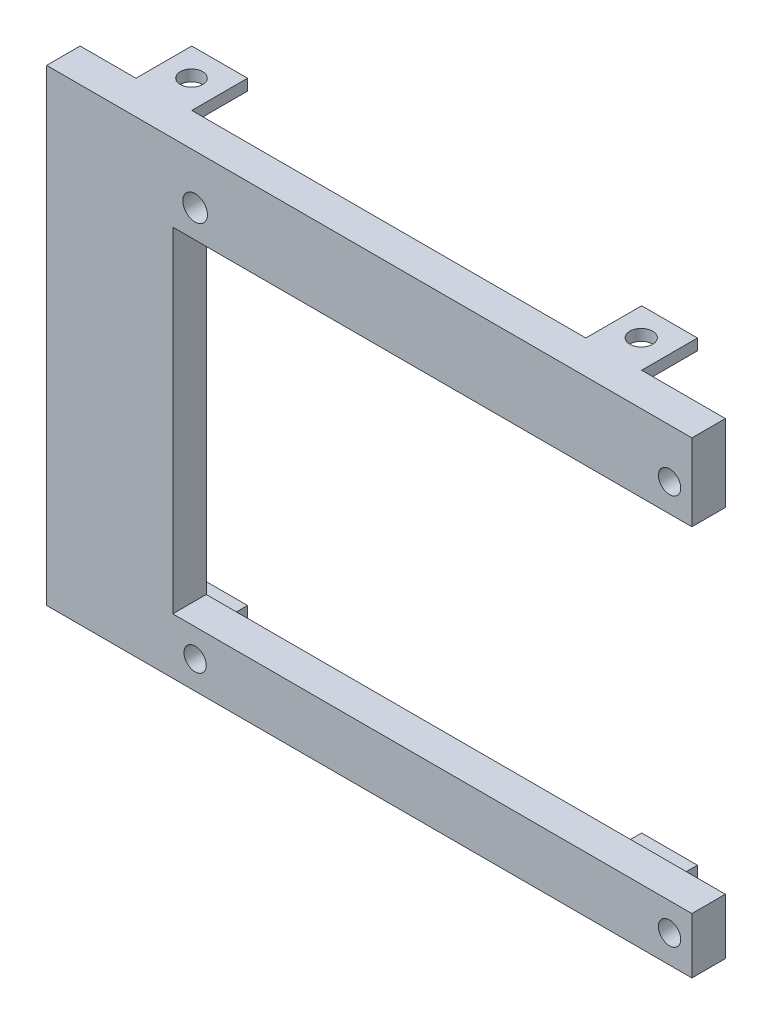
ISO-10303-21;
HEADER;
FILE_DESCRIPTION(('STEP AP214'),'2;1');
FILE_NAME('part.step','',(''),(''),'','','');
FILE_SCHEMA(('AUTOMOTIVE_DESIGN { 1 0 10303 214 1 1 1 1 }'));
ENDSEC;
DATA;
#1=APPLICATION_CONTEXT('core data for automotive mechanical design processes');
#2=APPLICATION_PROTOCOL_DEFINITION('international standard','automotive_design',2000,#1);
#3=PRODUCT_CONTEXT('',#1,'mechanical');
#4=PRODUCT('Part','Part','',(#3));
#5=PRODUCT_RELATED_PRODUCT_CATEGORY('part','',(#4));
#6=PRODUCT_DEFINITION_FORMATION('','',#4);
#7=PRODUCT_DEFINITION_CONTEXT('part definition',#1,'design');
#8=PRODUCT_DEFINITION('design','',#6,#7);
#9=PRODUCT_DEFINITION_SHAPE('','',#8);
#10=(LENGTH_UNIT() NAMED_UNIT(*) SI_UNIT(.MILLI.,.METRE.));
#11=(NAMED_UNIT(*) PLANE_ANGLE_UNIT() SI_UNIT($,.RADIAN.));
#12=(NAMED_UNIT(*) SI_UNIT($,.STERADIAN.) SOLID_ANGLE_UNIT());
#13=UNCERTAINTY_MEASURE_WITH_UNIT(LENGTH_MEASURE(1.E-05),#10,'distance_accuracy_value','');
#14=(GEOMETRIC_REPRESENTATION_CONTEXT(3) GLOBAL_UNCERTAINTY_ASSIGNED_CONTEXT((#13)) GLOBAL_UNIT_ASSIGNED_CONTEXT((#10,
#11,#12)) REPRESENTATION_CONTEXT('',''));
#15=CARTESIAN_POINT('',(0.,0.,0.));
#16=DIRECTION('',(0.,0.,1.));
#17=DIRECTION('',(1.,0.,0.));
#18=AXIS2_PLACEMENT_3D('',#15,#16,#17);
#19=CARTESIAN_POINT('',(-451.806796116505,304.386737633236,-5.99999999999989));
#20=DIRECTION('',(0.,0.,-1.));
#21=DIRECTION('',(-1.,0.,0.));
#22=AXIS2_PLACEMENT_3D('',#19,#20,#21);
#23=PLANE('',#22);
#24=CARTESIAN_POINT('',(-494.306796116505,269.386737633236,-5.9999999999999));
#25=DIRECTION('',(0.,0.,-1.));
#26=DIRECTION('',(0.,1.,0.));
#27=AXIS2_PLACEMENT_3D('',#24,#25,#26);
#28=CIRCLE('',#27,2.);
#29=CARTESIAN_POINT('',(-494.306796116505,271.386737633236,-5.9999999999999));
#30=VERTEX_POINT('',#29);
#31=EDGE_CURVE('E408',#30,#30,#28,.T.);
#32=ORIENTED_EDGE('',*,*,#31,.F.);
#33=EDGE_LOOP('',(#32));
#34=FACE_BOUND('',#33,.T.);
#35=CARTESIAN_POINT('',(-409.306796116505,269.386737633236,-5.9999999999999));
#36=DIRECTION('',(0.,0.,-1.));
#37=DIRECTION('',(0.,1.,0.));
#38=AXIS2_PLACEMENT_3D('',#35,#36,#37);
#39=CIRCLE('',#38,2.00480196291707);
#40=CARTESIAN_POINT('',(-409.306796116505,271.391539596154,-5.9999999999999));
#41=VERTEX_POINT('',#40);
#42=EDGE_CURVE('E492',#41,#41,#39,.T.);
#43=ORIENTED_EDGE('',*,*,#42,.F.);
#44=EDGE_LOOP('',(#43));
#45=FACE_BOUND('',#44,.T.);
#46=CARTESIAN_POINT('',(-409.306796116505,339.386737633236,-5.99999999999989));
#47=DIRECTION('',(0.,0.,-1.));
#48=DIRECTION('',(0.,1.,0.));
#49=AXIS2_PLACEMENT_3D('',#46,#47,#48);
#50=CIRCLE('',#49,2.);
#51=CARTESIAN_POINT('',(-409.306796116505,341.386737633236,-5.99999999999989));
#52=VERTEX_POINT('',#51);
#53=EDGE_CURVE('E496',#52,#52,#50,.T.);
#54=ORIENTED_EDGE('',*,*,#53,.F.);
#55=EDGE_LOOP('',(#54));
#56=FACE_BOUND('',#55,.T.);
#57=CARTESIAN_POINT('',(-494.306796116505,339.386737633236,-5.99999999999988));
#58=DIRECTION('',(0.,0.,-1.));
#59=DIRECTION('',(0.,1.,0.));
#60=AXIS2_PLACEMENT_3D('',#57,#58,#59);
#61=CIRCLE('',#60,2.20694831770408);
#62=CARTESIAN_POINT('',(-494.306796116505,341.59368595094,-5.99999999999988));
#63=VERTEX_POINT('',#62);
#64=EDGE_CURVE('E499',#63,#63,#61,.T.);
#65=ORIENTED_EDGE('',*,*,#64,.F.);
#66=EDGE_LOOP('',(#65));
#67=FACE_BOUND('',#66,.T.);
#68=DIRECTION('',(1.,0.,0.));
#69=VECTOR('',#68,1.);
#70=CARTESIAN_POINT('',(-520.906796116505,264.386737633237,-5.99999999999989));
#71=LINE('',#70,#69);
#72=CARTESIAN_POINT('',(-420.306796116505,264.386737633237,-5.9999999999999));
#73=VERTEX_POINT('',#72);
#74=CARTESIAN_POINT('',(-405.306796116505,264.386737633237,-5.99999999999989));
#75=VERTEX_POINT('',#74);
#76=EDGE_CURVE('E375',#73,#75,#71,.T.);
#77=ORIENTED_EDGE('',*,*,#76,.F.);
#78=DIRECTION('',(0.,-1.,0.));
#79=VECTOR('',#78,1.);
#80=CARTESIAN_POINT('',(-420.306796116505,266.386737633237,-5.9999999999999));
#81=LINE('',#80,#79);
#82=CARTESIAN_POINT('',(-420.306796116505,266.386737633237,-5.9999999999999));
#83=VERTEX_POINT('',#82);
#84=EDGE_CURVE('E73',#83,#73,#81,.T.);
#85=ORIENTED_EDGE('',*,*,#84,.F.);
#86=DIRECTION('',(1.,0.,0.));
#87=VECTOR('',#86,1.);
#88=CARTESIAN_POINT('',(-420.306796116505,266.386737633237,-5.9999999999999));
#89=LINE('',#88,#87);
#90=CARTESIAN_POINT('',(-430.306796116505,266.386737633237,-5.9999999999999));
#91=VERTEX_POINT('',#90);
#92=EDGE_CURVE('E239',#91,#83,#89,.T.);
#93=ORIENTED_EDGE('',*,*,#92,.F.);
#94=DIRECTION('',(0.,1.,0.));
#95=VECTOR('',#94,1.);
#96=CARTESIAN_POINT('',(-430.306796116505,266.386737633237,-5.9999999999999));
#97=LINE('',#96,#95);
#98=CARTESIAN_POINT('',(-430.306796116505,264.386737633237,-5.9999999999999));
#99=VERTEX_POINT('',#98);
#100=EDGE_CURVE('E421',#99,#91,#97,.T.);
#101=ORIENTED_EDGE('',*,*,#100,.F.);
#102=CARTESIAN_POINT('',(-500.906796116505,264.386737633237,-5.9999999999999));
#103=VERTEX_POINT('',#102);
#104=EDGE_CURVE('E374',#103,#99,#71,.T.);
#105=ORIENTED_EDGE('',*,*,#104,.F.);
#106=DIRECTION('',(0.,-1.,0.));
#107=VECTOR('',#106,1.);
#108=CARTESIAN_POINT('',(-500.906796116505,266.386737633237,-5.9999999999999));
#109=LINE('',#108,#107);
#110=CARTESIAN_POINT('',(-500.906796116505,266.386737633237,-5.9999999999999));
#111=VERTEX_POINT('',#110);
#112=EDGE_CURVE('E274',#111,#103,#109,.T.);
#113=ORIENTED_EDGE('',*,*,#112,.F.);
#114=DIRECTION('',(1.,0.,0.));
#115=VECTOR('',#114,1.);
#116=CARTESIAN_POINT('',(-500.906796116505,266.386737633237,-5.9999999999999));
#117=LINE('',#116,#115);
#118=CARTESIAN_POINT('',(-510.906796116505,266.386737633237,-5.99999999999989));
#119=VERTEX_POINT('',#118);
#120=EDGE_CURVE('E279',#119,#111,#117,.T.);
#121=ORIENTED_EDGE('',*,*,#120,.F.);
#122=DIRECTION('',(0.,1.,0.));
#123=VECTOR('',#122,1.);
#124=CARTESIAN_POINT('',(-510.906796116505,266.386737633237,-5.99999999999989));
#125=LINE('',#124,#123);
#126=CARTESIAN_POINT('',(-510.906796116505,264.386737633237,-5.9999999999999));
#127=VERTEX_POINT('',#126);
#128=EDGE_CURVE('E288',#127,#119,#125,.T.);
#129=ORIENTED_EDGE('',*,*,#128,.F.);
#130=CARTESIAN_POINT('',(-520.906796116505,264.386737633237,-5.99999999999989));
#131=VERTEX_POINT('',#130);
#132=EDGE_CURVE('E372',#131,#127,#71,.T.);
#133=ORIENTED_EDGE('',*,*,#132,.F.);
#134=DIRECTION('',(0.,-1.,0.));
#135=VECTOR('',#134,1.);
#136=CARTESIAN_POINT('',(-520.906796116505,348.186737633236,-5.99999999999989));
#137=LINE('',#136,#135);
#138=CARTESIAN_POINT('',(-520.906796116505,348.186737633236,-5.99999999999989));
#139=VERTEX_POINT('',#138);
#140=EDGE_CURVE('E369',#139,#131,#137,.T.);
#141=ORIENTED_EDGE('',*,*,#140,.F.);
#142=DIRECTION('',(1.,0.,0.));
#143=VECTOR('',#142,1.);
#144=CARTESIAN_POINT('',(-520.906796116505,348.186737633236,-5.99999999999989));
#145=LINE('',#144,#143);
#146=CARTESIAN_POINT('',(-510.906796116505,348.186737633236,-5.9999999999999));
#147=VERTEX_POINT('',#146);
#148=EDGE_CURVE('E366',#139,#147,#145,.T.);
#149=ORIENTED_EDGE('',*,*,#148,.T.);
#150=DIRECTION('',(0.,1.,0.));
#151=VECTOR('',#150,1.);
#152=CARTESIAN_POINT('',(-510.906796116505,348.186737633236,-5.99999999999988));
#153=LINE('',#152,#151);
#154=CARTESIAN_POINT('',(-510.906796116505,346.186737633236,-5.99999999999988));
#155=VERTEX_POINT('',#154);
#156=EDGE_CURVE('E305',#155,#147,#153,.T.);
#157=ORIENTED_EDGE('',*,*,#156,.F.);
#158=DIRECTION('',(-1.,0.,0.));
#159=VECTOR('',#158,1.);
#160=CARTESIAN_POINT('',(-500.906796116505,346.186737633236,-5.99999999999988));
#161=LINE('',#160,#159);
#162=CARTESIAN_POINT('',(-500.906796116505,346.186737633236,-5.99999999999988));
#163=VERTEX_POINT('',#162);
#164=EDGE_CURVE('E314',#163,#155,#161,.T.);
#165=ORIENTED_EDGE('',*,*,#164,.F.);
#166=DIRECTION('',(0.,-1.,0.));
#167=VECTOR('',#166,1.);
#168=CARTESIAN_POINT('',(-500.906796116505,348.186737633236,-5.99999999999988));
#169=LINE('',#168,#167);
#170=CARTESIAN_POINT('',(-500.906796116505,348.186737633236,-5.9999999999999));
#171=VERTEX_POINT('',#170);
#172=EDGE_CURVE('E300',#171,#163,#169,.T.);
#173=ORIENTED_EDGE('',*,*,#172,.F.);
#174=CARTESIAN_POINT('',(-430.306796116505,348.186737633236,-5.9999999999999));
#175=VERTEX_POINT('',#174);
#176=EDGE_CURVE('E368',#171,#175,#145,.T.);
#177=ORIENTED_EDGE('',*,*,#176,.T.);
#178=DIRECTION('',(0.,1.,0.));
#179=VECTOR('',#178,1.);
#180=CARTESIAN_POINT('',(-430.306796116505,348.186737633236,-5.99999999999989));
#181=LINE('',#180,#179);
#182=CARTESIAN_POINT('',(-430.306796116505,346.186737633236,-5.99999999999989));
#183=VERTEX_POINT('',#182);
#184=EDGE_CURVE('E254',#183,#175,#181,.T.);
#185=ORIENTED_EDGE('',*,*,#184,.F.);
#186=DIRECTION('',(-1.,0.,0.));
#187=VECTOR('',#186,1.);
#188=CARTESIAN_POINT('',(-420.306796116505,346.186737633236,-5.99999999999989));
#189=LINE('',#188,#187);
#190=CARTESIAN_POINT('',(-420.306796116505,346.186737633236,-5.99999999999989));
#191=VERTEX_POINT('',#190);
#192=EDGE_CURVE('E81',#191,#183,#189,.T.);
#193=ORIENTED_EDGE('',*,*,#192,.F.);
#194=DIRECTION('',(0.,-1.,0.));
#195=VECTOR('',#194,1.);
#196=CARTESIAN_POINT('',(-420.306796116505,348.186737633236,-5.99999999999989));
#197=LINE('',#196,#195);
#198=CARTESIAN_POINT('',(-420.306796116505,348.186737633236,-5.99999999999989));
#199=VERTEX_POINT('',#198);
#200=EDGE_CURVE('E242',#199,#191,#197,.T.);
#201=ORIENTED_EDGE('',*,*,#200,.F.);
#202=CARTESIAN_POINT('',(-405.306796116505,348.186737633236,-5.99999999999989));
#203=VERTEX_POINT('',#202);
#204=EDGE_CURVE('E338',#199,#203,#145,.T.);
#205=ORIENTED_EDGE('',*,*,#204,.T.);
#206=DIRECTION('',(0.,-1.,0.));
#207=VECTOR('',#206,1.);
#208=CARTESIAN_POINT('',(-405.306796116505,348.186737633236,-5.99999999999989));
#209=LINE('',#208,#207);
#210=CARTESIAN_POINT('',(-405.306796116505,334.386737633236,-5.99999999999989));
#211=VERTEX_POINT('',#210);
#212=EDGE_CURVE('E362',#203,#211,#209,.T.);
#213=ORIENTED_EDGE('',*,*,#212,.T.);
#214=DIRECTION('',(1.,0.,0.));
#215=VECTOR('',#214,1.);
#216=CARTESIAN_POINT('',(-498.306796116505,334.386737633236,-5.99999999999989));
#217=LINE('',#216,#215);
#218=CARTESIAN_POINT('',(-498.306796116505,334.386737633236,-5.99999999999989));
#219=VERTEX_POINT('',#218);
#220=EDGE_CURVE('E358',#219,#211,#217,.T.);
#221=ORIENTED_EDGE('',*,*,#220,.F.);
#222=DIRECTION('',(0.,-1.,0.));
#223=VECTOR('',#222,1.);
#224=CARTESIAN_POINT('',(-498.306796116505,334.386737633236,-5.99999999999989));
#225=LINE('',#224,#223);
#226=CARTESIAN_POINT('',(-498.306796116505,274.386737633237,-5.9999999999999));
#227=VERTEX_POINT('',#226);
#228=EDGE_CURVE('E365',#219,#227,#225,.T.);
#229=ORIENTED_EDGE('',*,*,#228,.T.);
#230=DIRECTION('',(1.,0.,0.));
#231=VECTOR('',#230,1.);
#232=CARTESIAN_POINT('',(-498.306796116505,274.386737633236,-5.99999999999989));
#233=LINE('',#232,#231);
#234=CARTESIAN_POINT('',(-405.306796116505,274.386737633236,-5.99999999999989));
#235=VERTEX_POINT('',#234);
#236=EDGE_CURVE('E65',#227,#235,#233,.T.);
#237=ORIENTED_EDGE('',*,*,#236,.T.);
#238=DIRECTION('',(0.,-1.,0.));
#239=VECTOR('',#238,1.);
#240=CARTESIAN_POINT('',(-405.306796116505,348.186737633236,-5.99999999999989));
#241=LINE('',#240,#239);
#242=EDGE_CURVE('E12',#235,#75,#241,.T.);
#243=ORIENTED_EDGE('',*,*,#242,.T.);
#244=EDGE_LOOP('',(#77,#85,#93,#101,#105,#113,#121,#129,#133,#141,#149,#157,#165,#173,#177,#185,
#193,#201,#205,#213,#221,#229,#237,#243));
#245=FACE_BOUND('',#244,.T.);
#246=ADVANCED_FACE('F57',(#34,#45,#56,#67,#245),#23,.T.);
#247=CARTESIAN_POINT('',(-405.306796116505,348.186737633236,-148.778849974357));
#248=DIRECTION('',(-1.,0.,0.));
#249=DIRECTION('',(0.,0.,1.));
#250=AXIS2_PLACEMENT_3D('',#247,#248,#249);
#251=PLANE('',#250);
#252=ORIENTED_EDGE('',*,*,#212,.F.);
#253=DIRECTION('',(0.,0.,1.));
#254=VECTOR('',#253,1.);
#255=CARTESIAN_POINT('',(-405.306796116505,348.186737633236,-148.778849974357));
#256=LINE('',#255,#254);
#257=CARTESIAN_POINT('',(-405.306796116505,348.186737633236,0.));
#258=VERTEX_POINT('',#257);
#259=EDGE_CURVE('E330',#203,#258,#256,.T.);
#260=ORIENTED_EDGE('',*,*,#259,.T.);
#261=DIRECTION('',(0.,-1.,0.));
#262=VECTOR('',#261,1.);
#263=CARTESIAN_POINT('',(-405.306796116505,348.186737633236,0.));
#264=LINE('',#263,#262);
#265=CARTESIAN_POINT('',(-405.306796116505,334.386737633236,0.));
#266=VERTEX_POINT('',#265);
#267=EDGE_CURVE('E339',#258,#266,#264,.T.);
#268=ORIENTED_EDGE('',*,*,#267,.T.);
#269=DIRECTION('',(0.,0.,1.));
#270=VECTOR('',#269,1.);
#271=CARTESIAN_POINT('',(-405.306796116505,334.386737633236,-148.778849974357));
#272=LINE('',#271,#270);
#273=EDGE_CURVE('E360',#211,#266,#272,.T.);
#274=ORIENTED_EDGE('',*,*,#273,.F.);
#275=EDGE_LOOP('',(#252,#260,#268,#274));
#276=FACE_BOUND('',#275,.T.);
#277=ADVANCED_FACE('F476',(#276),#251,.F.);
#278=CARTESIAN_POINT('',(-520.906796116505,348.186737633236,-148.778849974357));
#279=DIRECTION('',(0.,-1.,0.));
#280=DIRECTION('',(0.,0.,-1.));
#281=AXIS2_PLACEMENT_3D('',#278,#279,#280);
#282=PLANE('',#281);
#283=CARTESIAN_POINT('',(-425.380170540756,348.186737633236,-10.9999999999999));
#284=DIRECTION('',(0.,1.,0.));
#285=DIRECTION('',(0.,0.,1.));
#286=AXIS2_PLACEMENT_3D('',#283,#284,#285);
#287=CIRCLE('',#286,2.04002059682406);
#288=CARTESIAN_POINT('',(-425.380170540756,348.186737633236,-8.95997940317583));
#289=VERTEX_POINT('',#288);
#290=EDGE_CURVE('E393',#289,#289,#287,.T.);
#291=ORIENTED_EDGE('',*,*,#290,.F.);
#292=EDGE_LOOP('',(#291));
#293=FACE_BOUND('',#292,.T.);
#294=CARTESIAN_POINT('',(-505.952764670258,348.186737633236,-10.9999999999999));
#295=DIRECTION('',(0.,1.,0.));
#296=DIRECTION('',(0.,0.,1.));
#297=AXIS2_PLACEMENT_3D('',#294,#295,#296);
#298=CIRCLE('',#297,2.);
#299=CARTESIAN_POINT('',(-505.952764670258,348.186737633236,-8.9999999999999));
#300=VERTEX_POINT('',#299);
#301=EDGE_CURVE('E401',#300,#300,#298,.T.);
#302=ORIENTED_EDGE('',*,*,#301,.F.);
#303=EDGE_LOOP('',(#302));
#304=FACE_BOUND('',#303,.T.);
#305=ORIENTED_EDGE('',*,*,#148,.F.);
#306=DIRECTION('',(0.,0.,1.));
#307=VECTOR('',#306,1.);
#308=CARTESIAN_POINT('',(-520.906796116505,348.186737633236,-148.778849974357));
#309=LINE('',#308,#307);
#310=CARTESIAN_POINT('',(-520.906796116505,348.186737633236,0.));
#311=VERTEX_POINT('',#310);
#312=EDGE_CURVE('E342',#139,#311,#309,.T.);
#313=ORIENTED_EDGE('',*,*,#312,.T.);
#314=DIRECTION('',(1.,0.,0.));
#315=VECTOR('',#314,1.);
#316=CARTESIAN_POINT('',(-520.906796116505,348.186737633236,0.));
#317=LINE('',#316,#315);
#318=EDGE_CURVE('E344',#311,#258,#317,.T.);
#319=ORIENTED_EDGE('',*,*,#318,.T.);
#320=ORIENTED_EDGE('',*,*,#259,.F.);
#321=ORIENTED_EDGE('',*,*,#204,.F.);
#322=DIRECTION('',(0.,0.,1.));
#323=VECTOR('',#322,1.);
#324=CARTESIAN_POINT('',(-420.306796116505,348.186737633236,-15.9999999999999));
#325=LINE('',#324,#323);
#326=CARTESIAN_POINT('',(-420.306796116505,348.186737633236,-15.9999999999999));
#327=VERTEX_POINT('',#326);
#328=EDGE_CURVE('E259',#327,#199,#325,.T.);
#329=ORIENTED_EDGE('',*,*,#328,.F.);
#330=DIRECTION('',(1.,0.,0.));
#331=VECTOR('',#330,1.);
#332=CARTESIAN_POINT('',(-420.306796116505,348.186737633236,-15.9999999999999));
#333=LINE('',#332,#331);
#334=CARTESIAN_POINT('',(-430.306796116505,348.186737633236,-15.9999999999999));
#335=VERTEX_POINT('',#334);
#336=EDGE_CURVE('E258',#335,#327,#333,.T.);
#337=ORIENTED_EDGE('',*,*,#336,.F.);
#338=DIRECTION('',(0.,0.,1.));
#339=VECTOR('',#338,1.);
#340=CARTESIAN_POINT('',(-430.306796116505,348.186737633236,-15.9999999999999));
#341=LINE('',#340,#339);
#342=EDGE_CURVE('E266',#335,#175,#341,.T.);
#343=ORIENTED_EDGE('',*,*,#342,.T.);
#344=ORIENTED_EDGE('',*,*,#176,.F.);
#345=DIRECTION('',(0.,0.,1.));
#346=VECTOR('',#345,1.);
#347=CARTESIAN_POINT('',(-500.906796116505,348.186737633236,-15.9999999999999));
#348=LINE('',#347,#346);
#349=CARTESIAN_POINT('',(-500.906796116505,348.186737633236,-15.9999999999999));
#350=VERTEX_POINT('',#349);
#351=EDGE_CURVE('E311',#350,#171,#348,.T.);
#352=ORIENTED_EDGE('',*,*,#351,.F.);
#353=DIRECTION('',(1.,0.,0.));
#354=VECTOR('',#353,1.);
#355=CARTESIAN_POINT('',(-500.906796116505,348.186737633236,-15.9999999999999));
#356=LINE('',#355,#354);
#357=CARTESIAN_POINT('',(-510.906796116505,348.186737633236,-15.9999999999999));
#358=VERTEX_POINT('',#357);
#359=EDGE_CURVE('E309',#358,#350,#356,.T.);
#360=ORIENTED_EDGE('',*,*,#359,.F.);
#361=DIRECTION('',(0.,0.,1.));
#362=VECTOR('',#361,1.);
#363=CARTESIAN_POINT('',(-510.906796116505,348.186737633236,-15.9999999999999));
#364=LINE('',#363,#362);
#365=EDGE_CURVE('E321',#358,#147,#364,.T.);
#366=ORIENTED_EDGE('',*,*,#365,.T.);
#367=EDGE_LOOP('',(#305,#313,#319,#320,#321,#329,#337,#343,#344,#352,#360,#366));
#368=FACE_BOUND('',#367,.T.);
#369=ADVANCED_FACE('F483',(#293,#304,#368),#282,.F.);
#370=ORIENTED_EDGE('',*,*,#242,.F.);
#371=DIRECTION('',(0.,0.,1.));
#372=VECTOR('',#371,1.);
#373=CARTESIAN_POINT('',(-405.306796116505,274.386737633236,-148.778849974357));
#374=LINE('',#373,#372);
#375=CARTESIAN_POINT('',(-405.306796116505,274.386737633236,0.));
#376=VERTEX_POINT('',#375);
#377=EDGE_CURVE('E347',#235,#376,#374,.T.);
#378=ORIENTED_EDGE('',*,*,#377,.T.);
#379=CARTESIAN_POINT('',(-405.306796116505,264.386737633237,0.));
#380=VERTEX_POINT('',#379);
#381=EDGE_CURVE('E343',#376,#380,#264,.T.);
#382=ORIENTED_EDGE('',*,*,#381,.T.);
#383=DIRECTION('',(0.,0.,1.));
#384=VECTOR('',#383,1.);
#385=CARTESIAN_POINT('',(-405.306796116505,264.386737633237,-148.778849974357));
#386=LINE('',#385,#384);
#387=EDGE_CURVE('E371',#75,#380,#386,.T.);
#388=ORIENTED_EDGE('',*,*,#387,.F.);
#389=EDGE_LOOP('',(#370,#378,#382,#388));
#390=FACE_BOUND('',#389,.T.);
#391=ADVANCED_FACE('F436',(#390),#251,.F.);
#392=CARTESIAN_POINT('',(-520.906796116505,264.386737633237,-148.778849974357));
#393=DIRECTION('',(0.,-1.,0.));
#394=DIRECTION('',(0.,0.,-1.));
#395=AXIS2_PLACEMENT_3D('',#392,#393,#394);
#396=PLANE('',#395);
#397=CARTESIAN_POINT('',(-505.952764670258,264.386737633237,-10.9999999999999));
#398=DIRECTION('',(0.,-1.,0.));
#399=DIRECTION('',(0.,0.,-1.));
#400=AXIS2_PLACEMENT_3D('',#397,#398,#399);
#401=CIRCLE('',#400,2.);
#402=CARTESIAN_POINT('',(-505.952764670258,264.386737633237,-12.9999999999999));
#403=VERTEX_POINT('',#402);
#404=EDGE_CURVE('E397',#403,#403,#401,.T.);
#405=ORIENTED_EDGE('',*,*,#404,.F.);
#406=EDGE_LOOP('',(#405));
#407=FACE_BOUND('',#406,.T.);
#408=CARTESIAN_POINT('',(-425.380170540756,264.386737633237,-10.9999999999999));
#409=DIRECTION('',(0.,-1.,0.));
#410=DIRECTION('',(0.,0.,-1.));
#411=AXIS2_PLACEMENT_3D('',#408,#409,#410);
#412=CIRCLE('',#411,2.);
#413=CARTESIAN_POINT('',(-425.380170540756,264.386737633237,-12.9999999999999));
#414=VERTEX_POINT('',#413);
#415=EDGE_CURVE('E403',#414,#414,#412,.T.);
#416=ORIENTED_EDGE('',*,*,#415,.F.);
#417=EDGE_LOOP('',(#416));
#418=FACE_BOUND('',#417,.T.);
#419=DIRECTION('',(0.,0.,1.));
#420=VECTOR('',#419,1.);
#421=CARTESIAN_POINT('',(-520.906796116505,264.386737633237,-148.778849974357));
#422=LINE('',#421,#420);
#423=CARTESIAN_POINT('',(-520.906796116505,264.386737633237,0.));
#424=VERTEX_POINT('',#423);
#425=EDGE_CURVE('E361',#131,#424,#422,.T.);
#426=ORIENTED_EDGE('',*,*,#425,.F.);
#427=ORIENTED_EDGE('',*,*,#132,.T.);
#428=DIRECTION('',(0.,0.,1.));
#429=VECTOR('',#428,1.);
#430=CARTESIAN_POINT('',(-510.906796116505,264.386737633237,-15.9999999999999));
#431=LINE('',#430,#429);
#432=CARTESIAN_POINT('',(-510.906796116505,264.386737633237,-15.9999999999999));
#433=VERTEX_POINT('',#432);
#434=EDGE_CURVE('E296',#433,#127,#431,.T.);
#435=ORIENTED_EDGE('',*,*,#434,.F.);
#436=DIRECTION('',(-1.,0.,0.));
#437=VECTOR('',#436,1.);
#438=CARTESIAN_POINT('',(-500.906796116505,264.386737633237,-15.9999999999999));
#439=LINE('',#438,#437);
#440=CARTESIAN_POINT('',(-500.906796116505,264.386737633237,-15.9999999999999));
#441=VERTEX_POINT('',#440);
#442=EDGE_CURVE('E278',#441,#433,#439,.T.);
#443=ORIENTED_EDGE('',*,*,#442,.F.);
#444=DIRECTION('',(0.,0.,1.));
#445=VECTOR('',#444,1.);
#446=CARTESIAN_POINT('',(-500.906796116505,264.386737633237,-15.9999999999999));
#447=LINE('',#446,#445);
#448=EDGE_CURVE('E298',#441,#103,#447,.T.);
#449=ORIENTED_EDGE('',*,*,#448,.T.);
#450=ORIENTED_EDGE('',*,*,#104,.T.);
#451=DIRECTION('',(0.,0.,1.));
#452=VECTOR('',#451,1.);
#453=CARTESIAN_POINT('',(-430.306796116505,264.386737633237,-15.9999999999999));
#454=LINE('',#453,#452);
#455=CARTESIAN_POINT('',(-430.306796116505,264.386737633237,-15.9999999999999));
#456=VERTEX_POINT('',#455);
#457=EDGE_CURVE('E228',#456,#99,#454,.T.);
#458=ORIENTED_EDGE('',*,*,#457,.F.);
#459=DIRECTION('',(-1.,0.,0.));
#460=VECTOR('',#459,1.);
#461=CARTESIAN_POINT('',(-420.306796116505,264.386737633237,-15.9999999999999));
#462=LINE('',#461,#460);
#463=CARTESIAN_POINT('',(-420.306796116505,264.386737633237,-15.9999999999999));
#464=VERTEX_POINT('',#463);
#465=EDGE_CURVE('E221',#464,#456,#462,.T.);
#466=ORIENTED_EDGE('',*,*,#465,.F.);
#467=DIRECTION('',(0.,0.,1.));
#468=VECTOR('',#467,1.);
#469=CARTESIAN_POINT('',(-420.306796116505,264.386737633237,-15.9999999999999));
#470=LINE('',#469,#468);
#471=EDGE_CURVE('E225',#464,#73,#470,.T.);
#472=ORIENTED_EDGE('',*,*,#471,.T.);
#473=ORIENTED_EDGE('',*,*,#76,.T.);
#474=ORIENTED_EDGE('',*,*,#387,.T.);
#475=DIRECTION('',(1.,0.,0.));
#476=VECTOR('',#475,1.);
#477=CARTESIAN_POINT('',(-520.906796116505,264.386737633237,0.));
#478=LINE('',#477,#476);
#479=EDGE_CURVE('E334',#424,#380,#478,.T.);
#480=ORIENTED_EDGE('',*,*,#479,.F.);
#481=EDGE_LOOP('',(#426,#427,#435,#443,#449,#450,#458,#466,#472,#473,#474,#480));
#482=FACE_BOUND('',#481,.T.);
#483=ADVANCED_FACE('F224',(#407,#418,#482),#396,.T.);
#484=CARTESIAN_POINT('',(-520.906796116505,348.186737633236,-148.778849974357));
#485=DIRECTION('',(-1.,0.,0.));
#486=DIRECTION('',(0.,0.,1.));
#487=AXIS2_PLACEMENT_3D('',#484,#485,#486);
#488=PLANE('',#487);
#489=ORIENTED_EDGE('',*,*,#312,.F.);
#490=ORIENTED_EDGE('',*,*,#140,.T.);
#491=ORIENTED_EDGE('',*,*,#425,.T.);
#492=DIRECTION('',(0.,-1.,0.));
#493=VECTOR('',#492,1.);
#494=CARTESIAN_POINT('',(-520.906796116505,348.186737633236,0.));
#495=LINE('',#494,#493);
#496=EDGE_CURVE('E331',#311,#424,#495,.T.);
#497=ORIENTED_EDGE('',*,*,#496,.F.);
#498=EDGE_LOOP('',(#489,#490,#491,#497));
#499=FACE_BOUND('',#498,.T.);
#500=ADVANCED_FACE('F594',(#499),#488,.T.);
#501=CARTESIAN_POINT('',(-498.306796116505,334.386737633236,-148.778849974357));
#502=DIRECTION('',(0.,-1.,0.));
#503=DIRECTION('',(0.,0.,-1.));
#504=AXIS2_PLACEMENT_3D('',#501,#502,#503);
#505=PLANE('',#504);
#506=DIRECTION('',(0.,0.,1.));
#507=VECTOR('',#506,1.);
#508=CARTESIAN_POINT('',(-498.306796116505,334.386737633236,-148.778849974357));
#509=LINE('',#508,#507);
#510=CARTESIAN_POINT('',(-498.306796116505,334.386737633236,0.));
#511=VERTEX_POINT('',#510);
#512=EDGE_CURVE('E351',#219,#511,#509,.T.);
#513=ORIENTED_EDGE('',*,*,#512,.F.);
#514=ORIENTED_EDGE('',*,*,#220,.T.);
#515=ORIENTED_EDGE('',*,*,#273,.T.);
#516=DIRECTION('',(1.,0.,0.));
#517=VECTOR('',#516,1.);
#518=CARTESIAN_POINT('',(-498.306796116505,334.386737633236,0.));
#519=LINE('',#518,#517);
#520=EDGE_CURVE('E335',#511,#266,#519,.T.);
#521=ORIENTED_EDGE('',*,*,#520,.F.);
#522=EDGE_LOOP('',(#513,#514,#515,#521));
#523=FACE_BOUND('',#522,.T.);
#524=ADVANCED_FACE('F596',(#523),#505,.T.);
#525=CARTESIAN_POINT('',(-498.306796116505,274.386737633236,-148.778849974357));
#526=DIRECTION('',(0.,-1.,0.));
#527=DIRECTION('',(0.,0.,-1.));
#528=AXIS2_PLACEMENT_3D('',#525,#526,#527);
#529=PLANE('',#528);
#530=ORIENTED_EDGE('',*,*,#236,.F.);
#531=DIRECTION('',(0.,0.,1.));
#532=VECTOR('',#531,1.);
#533=CARTESIAN_POINT('',(-498.306796116505,274.386737633236,-148.778849974357));
#534=LINE('',#533,#532);
#535=CARTESIAN_POINT('',(-498.306796116505,274.386737633236,0.));
#536=VERTEX_POINT('',#535);
#537=EDGE_CURVE('E355',#227,#536,#534,.T.);
#538=ORIENTED_EDGE('',*,*,#537,.T.);
#539=DIRECTION('',(1.,0.,0.));
#540=VECTOR('',#539,1.);
#541=CARTESIAN_POINT('',(-498.306796116505,274.386737633236,0.));
#542=LINE('',#541,#540);
#543=EDGE_CURVE('E352',#536,#376,#542,.T.);
#544=ORIENTED_EDGE('',*,*,#543,.T.);
#545=ORIENTED_EDGE('',*,*,#377,.F.);
#546=EDGE_LOOP('',(#530,#538,#544,#545));
#547=FACE_BOUND('',#546,.T.);
#548=ADVANCED_FACE('F602',(#547),#529,.F.);
#549=CARTESIAN_POINT('',(-498.306796116505,334.386737633236,-148.778849974357));
#550=DIRECTION('',(-1.,0.,0.));
#551=DIRECTION('',(0.,0.,1.));
#552=AXIS2_PLACEMENT_3D('',#549,#550,#551);
#553=PLANE('',#552);
#554=ORIENTED_EDGE('',*,*,#228,.F.);
#555=ORIENTED_EDGE('',*,*,#512,.T.);
#556=DIRECTION('',(0.,-1.,0.));
#557=VECTOR('',#556,1.);
#558=CARTESIAN_POINT('',(-498.306796116505,334.386737633236,0.));
#559=LINE('',#558,#557);
#560=EDGE_CURVE('E348',#511,#536,#559,.T.);
#561=ORIENTED_EDGE('',*,*,#560,.T.);
#562=ORIENTED_EDGE('',*,*,#537,.F.);
#563=EDGE_LOOP('',(#554,#555,#561,#562));
#564=FACE_BOUND('',#563,.T.);
#565=ADVANCED_FACE('F530',(#564),#553,.F.);
#566=CARTESIAN_POINT('',(0.,0.,0.));
#567=DIRECTION('',(0.,0.,-1.));
#568=DIRECTION('',(-1.,0.,0.));
#569=AXIS2_PLACEMENT_3D('',#566,#567,#568);
#570=PLANE('',#569);
#571=CARTESIAN_POINT('',(-494.306796116505,269.386737633236,0.));
#572=DIRECTION('',(0.,0.,1.));
#573=DIRECTION('',(1.,0.,0.));
#574=AXIS2_PLACEMENT_3D('',#571,#572,#573);
#575=CIRCLE('',#574,2.);
#576=CARTESIAN_POINT('',(-492.306796116505,269.386737633236,0.));
#577=VERTEX_POINT('',#576);
#578=EDGE_CURVE('E517',#577,#577,#575,.T.);
#579=ORIENTED_EDGE('',*,*,#578,.F.);
#580=EDGE_LOOP('',(#579));
#581=FACE_BOUND('',#580,.T.);
#582=CARTESIAN_POINT('',(-409.306796116505,269.386737633236,0.));
#583=DIRECTION('',(0.,0.,1.));
#584=DIRECTION('',(1.,0.,0.));
#585=AXIS2_PLACEMENT_3D('',#582,#583,#584);
#586=CIRCLE('',#585,2.00480196291707);
#587=CARTESIAN_POINT('',(-407.301994153588,269.386737633236,0.));
#588=VERTEX_POINT('',#587);
#589=EDGE_CURVE('E519',#588,#588,#586,.T.);
#590=ORIENTED_EDGE('',*,*,#589,.F.);
#591=EDGE_LOOP('',(#590));
#592=FACE_BOUND('',#591,.T.);
#593=CARTESIAN_POINT('',(-409.306796116505,339.386737633236,0.));
#594=DIRECTION('',(0.,0.,1.));
#595=DIRECTION('',(1.,0.,0.));
#596=AXIS2_PLACEMENT_3D('',#593,#594,#595);
#597=CIRCLE('',#596,2.);
#598=CARTESIAN_POINT('',(-407.306796116505,339.386737633236,0.));
#599=VERTEX_POINT('',#598);
#600=EDGE_CURVE('E505',#599,#599,#597,.T.);
#601=ORIENTED_EDGE('',*,*,#600,.F.);
#602=EDGE_LOOP('',(#601));
#603=FACE_BOUND('',#602,.T.);
#604=CARTESIAN_POINT('',(-494.306796116505,339.386737633236,0.));
#605=DIRECTION('',(0.,0.,1.));
#606=DIRECTION('',(1.,0.,0.));
#607=AXIS2_PLACEMENT_3D('',#604,#605,#606);
#608=CIRCLE('',#607,2.20694831770408);
#609=CARTESIAN_POINT('',(-492.099847798801,339.386737633236,0.));
#610=VERTEX_POINT('',#609);
#611=EDGE_CURVE('E501',#610,#610,#608,.T.);
#612=ORIENTED_EDGE('',*,*,#611,.F.);
#613=EDGE_LOOP('',(#612));
#614=FACE_BOUND('',#613,.T.);
#615=ORIENTED_EDGE('',*,*,#520,.T.);
#616=ORIENTED_EDGE('',*,*,#267,.F.);
#617=ORIENTED_EDGE('',*,*,#318,.F.);
#618=ORIENTED_EDGE('',*,*,#496,.T.);
#619=ORIENTED_EDGE('',*,*,#479,.T.);
#620=ORIENTED_EDGE('',*,*,#381,.F.);
#621=ORIENTED_EDGE('',*,*,#543,.F.);
#622=ORIENTED_EDGE('',*,*,#560,.F.);
#623=EDGE_LOOP('',(#615,#616,#617,#618,#619,#620,#621,#622));
#624=FACE_BOUND('',#623,.T.);
#625=ADVANCED_FACE('F441',(#581,#592,#603,#614,#624),#570,.F.);
#626=CARTESIAN_POINT('',(-500.906796116505,348.186737633236,-15.9999999999999));
#627=DIRECTION('',(-1.,0.,0.));
#628=DIRECTION('',(0.,0.,1.));
#629=AXIS2_PLACEMENT_3D('',#626,#627,#628);
#630=PLANE('',#629);
#631=ORIENTED_EDGE('',*,*,#172,.T.);
#632=DIRECTION('',(0.,0.,1.));
#633=VECTOR('',#632,1.);
#634=CARTESIAN_POINT('',(-500.906796116505,346.186737633236,-15.9999999999999));
#635=LINE('',#634,#633);
#636=CARTESIAN_POINT('',(-500.906796116505,346.186737633236,-15.9999999999999));
#637=VERTEX_POINT('',#636);
#638=EDGE_CURVE('E327',#637,#163,#635,.T.);
#639=ORIENTED_EDGE('',*,*,#638,.F.);
#640=DIRECTION('',(0.,-1.,0.));
#641=VECTOR('',#640,1.);
#642=CARTESIAN_POINT('',(-500.906796116505,348.186737633236,-15.9999999999999));
#643=LINE('',#642,#641);
#644=EDGE_CURVE('E301',#350,#637,#643,.T.);
#645=ORIENTED_EDGE('',*,*,#644,.F.);
#646=ORIENTED_EDGE('',*,*,#351,.T.);
#647=EDGE_LOOP('',(#631,#639,#645,#646));
#648=FACE_BOUND('',#647,.T.);
#649=ADVANCED_FACE('F529',(#648),#630,.F.);
#650=CARTESIAN_POINT('',(-500.906796116505,346.186737633236,-15.9999999999999));
#651=DIRECTION('',(0.,1.,0.));
#652=DIRECTION('',(0.,0.,1.));
#653=AXIS2_PLACEMENT_3D('',#650,#651,#652);
#654=PLANE('',#653);
#655=CARTESIAN_POINT('',(-505.952764670258,346.186737633236,-10.9999999999999));
#656=DIRECTION('',(0.,1.,0.));
#657=DIRECTION('',(0.,0.,1.));
#658=AXIS2_PLACEMENT_3D('',#655,#656,#657);
#659=CIRCLE('',#658,2.);
#660=CARTESIAN_POINT('',(-505.952764670258,346.186737633236,-8.9999999999999));
#661=VERTEX_POINT('',#660);
#662=EDGE_CURVE('E392',#661,#661,#659,.T.);
#663=ORIENTED_EDGE('',*,*,#662,.T.);
#664=EDGE_LOOP('',(#663));
#665=FACE_BOUND('',#664,.T.);
#666=ORIENTED_EDGE('',*,*,#164,.T.);
#667=DIRECTION('',(0.,0.,1.));
#668=VECTOR('',#667,1.);
#669=CARTESIAN_POINT('',(-510.906796116505,346.186737633236,-15.9999999999999));
#670=LINE('',#669,#668);
#671=CARTESIAN_POINT('',(-510.906796116505,346.186737633236,-15.9999999999999));
#672=VERTEX_POINT('',#671);
#673=EDGE_CURVE('E324',#672,#155,#670,.T.);
#674=ORIENTED_EDGE('',*,*,#673,.F.);
#675=DIRECTION('',(-1.,0.,0.));
#676=VECTOR('',#675,1.);
#677=CARTESIAN_POINT('',(-500.906796116505,346.186737633236,-15.9999999999999));
#678=LINE('',#677,#676);
#679=EDGE_CURVE('E304',#637,#672,#678,.T.);
#680=ORIENTED_EDGE('',*,*,#679,.F.);
#681=ORIENTED_EDGE('',*,*,#638,.T.);
#682=EDGE_LOOP('',(#666,#674,#680,#681));
#683=FACE_BOUND('',#682,.T.);
#684=ADVANCED_FACE('F626',(#665,#683),#654,.F.);
#685=CARTESIAN_POINT('',(-510.906796116505,348.186737633236,-15.9999999999999));
#686=DIRECTION('',(1.,0.,0.));
#687=DIRECTION('',(0.,0.,-1.));
#688=AXIS2_PLACEMENT_3D('',#685,#686,#687);
#689=PLANE('',#688);
#690=ORIENTED_EDGE('',*,*,#156,.T.);
#691=ORIENTED_EDGE('',*,*,#365,.F.);
#692=DIRECTION('',(0.,1.,0.));
#693=VECTOR('',#692,1.);
#694=CARTESIAN_POINT('',(-510.906796116505,348.186737633236,-15.9999999999999));
#695=LINE('',#694,#693);
#696=EDGE_CURVE('E307',#672,#358,#695,.T.);
#697=ORIENTED_EDGE('',*,*,#696,.F.);
#698=ORIENTED_EDGE('',*,*,#673,.T.);
#699=EDGE_LOOP('',(#690,#691,#697,#698));
#700=FACE_BOUND('',#699,.T.);
#701=ADVANCED_FACE('F629',(#700),#689,.F.);
#702=CARTESIAN_POINT('',(0.,0.,-15.9999999999999));
#703=DIRECTION('',(0.,0.,-1.));
#704=DIRECTION('',(-1.,0.,0.));
#705=AXIS2_PLACEMENT_3D('',#702,#703,#704);
#706=PLANE('',#705);
#707=ORIENTED_EDGE('',*,*,#644,.T.);
#708=ORIENTED_EDGE('',*,*,#679,.T.);
#709=ORIENTED_EDGE('',*,*,#696,.T.);
#710=ORIENTED_EDGE('',*,*,#359,.T.);
#711=EDGE_LOOP('',(#707,#708,#709,#710));
#712=FACE_BOUND('',#711,.T.);
#713=ADVANCED_FACE('F638',(#712),#706,.T.);
#714=CARTESIAN_POINT('',(-500.906796116505,266.386737633237,-15.9999999999999));
#715=DIRECTION('',(-1.,0.,0.));
#716=DIRECTION('',(0.,0.,1.));
#717=AXIS2_PLACEMENT_3D('',#714,#715,#716);
#718=PLANE('',#717);
#719=ORIENTED_EDGE('',*,*,#112,.T.);
#720=ORIENTED_EDGE('',*,*,#448,.F.);
#721=DIRECTION('',(0.,-1.,0.));
#722=VECTOR('',#721,1.);
#723=CARTESIAN_POINT('',(-500.906796116505,266.386737633237,-15.9999999999999));
#724=LINE('',#723,#722);
#725=CARTESIAN_POINT('',(-500.906796116505,266.386737633237,-15.9999999999999));
#726=VERTEX_POINT('',#725);
#727=EDGE_CURVE('E275',#726,#441,#724,.T.);
#728=ORIENTED_EDGE('',*,*,#727,.F.);
#729=DIRECTION('',(0.,0.,1.));
#730=VECTOR('',#729,1.);
#731=CARTESIAN_POINT('',(-500.906796116505,266.386737633237,-15.9999999999999));
#732=LINE('',#731,#730);
#733=EDGE_CURVE('E285',#726,#111,#732,.T.);
#734=ORIENTED_EDGE('',*,*,#733,.T.);
#735=EDGE_LOOP('',(#719,#720,#728,#734));
#736=FACE_BOUND('',#735,.T.);
#737=ADVANCED_FACE('F462',(#736),#718,.F.);
#738=CARTESIAN_POINT('',(-510.906796116505,266.386737633237,-15.9999999999999));
#739=DIRECTION('',(1.,0.,0.));
#740=DIRECTION('',(0.,0.,-1.));
#741=AXIS2_PLACEMENT_3D('',#738,#739,#740);
#742=PLANE('',#741);
#743=ORIENTED_EDGE('',*,*,#128,.T.);
#744=DIRECTION('',(0.,0.,1.));
#745=VECTOR('',#744,1.);
#746=CARTESIAN_POINT('',(-510.906796116505,266.386737633237,-15.9999999999999));
#747=LINE('',#746,#745);
#748=CARTESIAN_POINT('',(-510.906796116505,266.386737633237,-15.9999999999999));
#749=VERTEX_POINT('',#748);
#750=EDGE_CURVE('E294',#749,#119,#747,.T.);
#751=ORIENTED_EDGE('',*,*,#750,.F.);
#752=DIRECTION('',(0.,1.,0.));
#753=VECTOR('',#752,1.);
#754=CARTESIAN_POINT('',(-510.906796116505,266.386737633237,-15.9999999999999));
#755=LINE('',#754,#753);
#756=EDGE_CURVE('E281',#433,#749,#755,.T.);
#757=ORIENTED_EDGE('',*,*,#756,.F.);
#758=ORIENTED_EDGE('',*,*,#434,.T.);
#759=EDGE_LOOP('',(#743,#751,#757,#758));
#760=FACE_BOUND('',#759,.T.);
#761=ADVANCED_FACE('F453',(#760),#742,.F.);
#762=CARTESIAN_POINT('',(-500.906796116505,266.386737633237,-15.9999999999999));
#763=DIRECTION('',(0.,-1.,0.));
#764=DIRECTION('',(0.,0.,-1.));
#765=AXIS2_PLACEMENT_3D('',#762,#763,#764);
#766=PLANE('',#765);
#767=CARTESIAN_POINT('',(-505.952764670258,266.386737633237,-10.9999999999999));
#768=DIRECTION('',(0.,-1.,0.));
#769=DIRECTION('',(0.,0.,-1.));
#770=AXIS2_PLACEMENT_3D('',#767,#768,#769);
#771=CIRCLE('',#770,2.);
#772=CARTESIAN_POINT('',(-505.952764670258,266.386737633237,-12.9999999999999));
#773=VERTEX_POINT('',#772);
#774=EDGE_CURVE('E60',#773,#773,#771,.T.);
#775=ORIENTED_EDGE('',*,*,#774,.T.);
#776=EDGE_LOOP('',(#775));
#777=FACE_BOUND('',#776,.T.);
#778=ORIENTED_EDGE('',*,*,#120,.T.);
#779=ORIENTED_EDGE('',*,*,#733,.F.);
#780=DIRECTION('',(1.,0.,0.));
#781=VECTOR('',#780,1.);
#782=CARTESIAN_POINT('',(-500.906796116505,266.386737633237,-15.9999999999999));
#783=LINE('',#782,#781);
#784=EDGE_CURVE('E283',#749,#726,#783,.T.);
#785=ORIENTED_EDGE('',*,*,#784,.F.);
#786=ORIENTED_EDGE('',*,*,#750,.T.);
#787=EDGE_LOOP('',(#778,#779,#785,#786));
#788=FACE_BOUND('',#787,.T.);
#789=ADVANCED_FACE('F464',(#777,#788),#766,.F.);
#790=CARTESIAN_POINT('',(0.,0.,-16.0000000000001));
#791=DIRECTION('',(0.,0.,-1.));
#792=DIRECTION('',(0.,1.,0.));
#793=AXIS2_PLACEMENT_3D('',#790,#791,#792);
#794=PLANE('',#793);
#795=ORIENTED_EDGE('',*,*,#727,.T.);
#796=ORIENTED_EDGE('',*,*,#442,.T.);
#797=ORIENTED_EDGE('',*,*,#756,.T.);
#798=ORIENTED_EDGE('',*,*,#784,.T.);
#799=EDGE_LOOP('',(#795,#796,#797,#798));
#800=FACE_BOUND('',#799,.T.);
#801=ADVANCED_FACE('F459',(#800),#794,.T.);
#802=CARTESIAN_POINT('',(-420.306796116505,348.186737633236,-15.9999999999999));
#803=DIRECTION('',(-1.,0.,0.));
#804=DIRECTION('',(0.,0.,1.));
#805=AXIS2_PLACEMENT_3D('',#802,#803,#804);
#806=PLANE('',#805);
#807=ORIENTED_EDGE('',*,*,#200,.T.);
#808=DIRECTION('',(0.,0.,1.));
#809=VECTOR('',#808,1.);
#810=CARTESIAN_POINT('',(-420.306796116505,346.186737633236,-15.9999999999999));
#811=LINE('',#810,#809);
#812=CARTESIAN_POINT('',(-420.306796116505,346.186737633236,-15.9999999999999));
#813=VERTEX_POINT('',#812);
#814=EDGE_CURVE('E272',#813,#191,#811,.T.);
#815=ORIENTED_EDGE('',*,*,#814,.F.);
#816=DIRECTION('',(0.,-1.,0.));
#817=VECTOR('',#816,1.);
#818=CARTESIAN_POINT('',(-420.306796116505,348.186737633236,-15.9999999999999));
#819=LINE('',#818,#817);
#820=EDGE_CURVE('E250',#327,#813,#819,.T.);
#821=ORIENTED_EDGE('',*,*,#820,.F.);
#822=ORIENTED_EDGE('',*,*,#328,.T.);
#823=EDGE_LOOP('',(#807,#815,#821,#822));
#824=FACE_BOUND('',#823,.T.);
#825=ADVANCED_FACE('F472',(#824),#806,.F.);
#826=CARTESIAN_POINT('',(-420.306796116505,346.186737633236,-15.9999999999999));
#827=DIRECTION('',(0.,1.,0.));
#828=DIRECTION('',(0.,0.,1.));
#829=AXIS2_PLACEMENT_3D('',#826,#827,#828);
#830=PLANE('',#829);
#831=CARTESIAN_POINT('',(-425.380170540756,346.186737633236,-10.9999999999999));
#832=DIRECTION('',(0.,1.,0.));
#833=DIRECTION('',(0.,0.,1.));
#834=AXIS2_PLACEMENT_3D('',#831,#832,#833);
#835=CIRCLE('',#834,2.04002059682406);
#836=CARTESIAN_POINT('',(-425.380170540756,346.186737633236,-8.95997940317583));
#837=VERTEX_POINT('',#836);
#838=EDGE_CURVE('E389',#837,#837,#835,.T.);
#839=ORIENTED_EDGE('',*,*,#838,.T.);
#840=EDGE_LOOP('',(#839));
#841=FACE_BOUND('',#840,.T.);
#842=ORIENTED_EDGE('',*,*,#192,.T.);
#843=DIRECTION('',(0.,0.,1.));
#844=VECTOR('',#843,1.);
#845=CARTESIAN_POINT('',(-430.306796116505,346.186737633236,-15.9999999999999));
#846=LINE('',#845,#844);
#847=CARTESIAN_POINT('',(-430.306796116505,346.186737633236,-15.9999999999999));
#848=VERTEX_POINT('',#847);
#849=EDGE_CURVE('E269',#848,#183,#846,.T.);
#850=ORIENTED_EDGE('',*,*,#849,.F.);
#851=DIRECTION('',(-1.,0.,0.));
#852=VECTOR('',#851,1.);
#853=CARTESIAN_POINT('',(-420.306796116505,346.186737633236,-15.9999999999999));
#854=LINE('',#853,#852);
#855=EDGE_CURVE('E253',#813,#848,#854,.T.);
#856=ORIENTED_EDGE('',*,*,#855,.F.);
#857=ORIENTED_EDGE('',*,*,#814,.T.);
#858=EDGE_LOOP('',(#842,#850,#856,#857));
#859=FACE_BOUND('',#858,.T.);
#860=ADVANCED_FACE('F575',(#841,#859),#830,.F.);
#861=CARTESIAN_POINT('',(-430.306796116505,348.186737633236,-15.9999999999999));
#862=DIRECTION('',(1.,0.,0.));
#863=DIRECTION('',(0.,0.,-1.));
#864=AXIS2_PLACEMENT_3D('',#861,#862,#863);
#865=PLANE('',#864);
#866=ORIENTED_EDGE('',*,*,#184,.T.);
#867=ORIENTED_EDGE('',*,*,#342,.F.);
#868=DIRECTION('',(0.,1.,0.));
#869=VECTOR('',#868,1.);
#870=CARTESIAN_POINT('',(-430.306796116505,348.186737633236,-15.9999999999999));
#871=LINE('',#870,#869);
#872=EDGE_CURVE('E256',#848,#335,#871,.T.);
#873=ORIENTED_EDGE('',*,*,#872,.F.);
#874=ORIENTED_EDGE('',*,*,#849,.T.);
#875=EDGE_LOOP('',(#866,#867,#873,#874));
#876=FACE_BOUND('',#875,.T.);
#877=ADVANCED_FACE('F571',(#876),#865,.F.);
#878=CARTESIAN_POINT('',(0.,0.,-15.9999999999999));
#879=DIRECTION('',(0.,0.,-1.));
#880=DIRECTION('',(-1.,0.,0.));
#881=AXIS2_PLACEMENT_3D('',#878,#879,#880);
#882=PLANE('',#881);
#883=ORIENTED_EDGE('',*,*,#820,.T.);
#884=ORIENTED_EDGE('',*,*,#855,.T.);
#885=ORIENTED_EDGE('',*,*,#872,.T.);
#886=ORIENTED_EDGE('',*,*,#336,.T.);
#887=EDGE_LOOP('',(#883,#884,#885,#886));
#888=FACE_BOUND('',#887,.T.);
#889=ADVANCED_FACE('F568',(#888),#882,.T.);
#890=CARTESIAN_POINT('',(-420.306796116505,266.386737633237,-15.9999999999999));
#891=DIRECTION('',(-1.,0.,0.));
#892=DIRECTION('',(0.,0.,1.));
#893=AXIS2_PLACEMENT_3D('',#890,#891,#892);
#894=PLANE('',#893);
#895=ORIENTED_EDGE('',*,*,#84,.T.);
#896=ORIENTED_EDGE('',*,*,#471,.F.);
#897=DIRECTION('',(0.,-1.,0.));
#898=VECTOR('',#897,1.);
#899=CARTESIAN_POINT('',(-420.306796116505,266.386737633237,-15.9999999999999));
#900=LINE('',#899,#898);
#901=CARTESIAN_POINT('',(-420.306796116505,266.386737633237,-15.9999999999999));
#902=VERTEX_POINT('',#901);
#903=EDGE_CURVE('E232',#902,#464,#900,.T.);
#904=ORIENTED_EDGE('',*,*,#903,.F.);
#905=DIRECTION('',(0.,0.,1.));
#906=VECTOR('',#905,1.);
#907=CARTESIAN_POINT('',(-420.306796116505,266.386737633237,-15.9999999999999));
#908=LINE('',#907,#906);
#909=EDGE_CURVE('E419',#902,#83,#908,.T.);
#910=ORIENTED_EDGE('',*,*,#909,.T.);
#911=EDGE_LOOP('',(#895,#896,#904,#910));
#912=FACE_BOUND('',#911,.T.);
#913=ADVANCED_FACE('F241',(#912),#894,.F.);
#914=CARTESIAN_POINT('',(-430.306796116505,266.386737633237,-15.9999999999999));
#915=DIRECTION('',(1.,0.,0.));
#916=DIRECTION('',(0.,0.,-1.));
#917=AXIS2_PLACEMENT_3D('',#914,#915,#916);
#918=PLANE('',#917);
#919=ORIENTED_EDGE('',*,*,#100,.T.);
#920=DIRECTION('',(0.,0.,1.));
#921=VECTOR('',#920,1.);
#922=CARTESIAN_POINT('',(-430.306796116505,266.386737633237,-15.9999999999999));
#923=LINE('',#922,#921);
#924=CARTESIAN_POINT('',(-430.306796116505,266.386737633237,-15.9999999999999));
#925=VERTEX_POINT('',#924);
#926=EDGE_CURVE('E246',#925,#91,#923,.T.);
#927=ORIENTED_EDGE('',*,*,#926,.F.);
#928=DIRECTION('',(0.,1.,0.));
#929=VECTOR('',#928,1.);
#930=CARTESIAN_POINT('',(-430.306796116505,266.386737633237,-15.9999999999999));
#931=LINE('',#930,#929);
#932=EDGE_CURVE('E231',#456,#925,#931,.T.);
#933=ORIENTED_EDGE('',*,*,#932,.F.);
#934=ORIENTED_EDGE('',*,*,#457,.T.);
#935=EDGE_LOOP('',(#919,#927,#933,#934));
#936=FACE_BOUND('',#935,.T.);
#937=ADVANCED_FACE('F563',(#936),#918,.F.);
#938=CARTESIAN_POINT('',(-420.306796116505,266.386737633237,-15.9999999999999));
#939=DIRECTION('',(0.,-1.,0.));
#940=DIRECTION('',(0.,0.,-1.));
#941=AXIS2_PLACEMENT_3D('',#938,#939,#940);
#942=PLANE('',#941);
#943=CARTESIAN_POINT('',(-425.380170540756,266.386737633237,-10.9999999999999));
#944=DIRECTION('',(0.,-1.,0.));
#945=DIRECTION('',(0.,0.,-1.));
#946=AXIS2_PLACEMENT_3D('',#943,#944,#945);
#947=CIRCLE('',#946,2.);
#948=CARTESIAN_POINT('',(-425.380170540756,266.386737633237,-12.9999999999999));
#949=VERTEX_POINT('',#948);
#950=EDGE_CURVE('E395',#949,#949,#947,.T.);
#951=ORIENTED_EDGE('',*,*,#950,.T.);
#952=EDGE_LOOP('',(#951));
#953=FACE_BOUND('',#952,.T.);
#954=ORIENTED_EDGE('',*,*,#92,.T.);
#955=ORIENTED_EDGE('',*,*,#909,.F.);
#956=DIRECTION('',(1.,0.,0.));
#957=VECTOR('',#956,1.);
#958=CARTESIAN_POINT('',(-420.306796116505,266.386737633237,-15.9999999999999));
#959=LINE('',#958,#957);
#960=EDGE_CURVE('E237',#925,#902,#959,.T.);
#961=ORIENTED_EDGE('',*,*,#960,.F.);
#962=ORIENTED_EDGE('',*,*,#926,.T.);
#963=EDGE_LOOP('',(#954,#955,#961,#962));
#964=FACE_BOUND('',#963,.T.);
#965=ADVANCED_FACE('F428',(#953,#964),#942,.F.);
#966=CARTESIAN_POINT('',(0.,0.,-16.0000000000001));
#967=DIRECTION('',(0.,0.,-1.));
#968=DIRECTION('',(0.,1.,0.));
#969=AXIS2_PLACEMENT_3D('',#966,#967,#968);
#970=PLANE('',#969);
#971=ORIENTED_EDGE('',*,*,#903,.T.);
#972=ORIENTED_EDGE('',*,*,#465,.T.);
#973=ORIENTED_EDGE('',*,*,#932,.T.);
#974=ORIENTED_EDGE('',*,*,#960,.T.);
#975=EDGE_LOOP('',(#971,#972,#973,#974));
#976=FACE_BOUND('',#975,.T.);
#977=ADVANCED_FACE('F235',(#976),#970,.T.);
#978=CARTESIAN_POINT('',(-425.380170540756,339.186737633236,-10.9999999999999));
#979=DIRECTION('',(0.,1.,0.));
#980=DIRECTION('',(0.,0.,1.));
#981=AXIS2_PLACEMENT_3D('',#978,#979,#980);
#982=CYLINDRICAL_SURFACE('',#981,2.04002059682406);
#983=ORIENTED_EDGE('',*,*,#290,.T.);
#984=EDGE_LOOP('',(#983));
#985=FACE_BOUND('',#984,.T.);
#986=ORIENTED_EDGE('',*,*,#838,.F.);
#987=EDGE_LOOP('',(#986));
#988=FACE_BOUND('',#987,.T.);
#989=ADVANCED_FACE('F552',(#985,#988),#982,.F.);
#990=CARTESIAN_POINT('',(-505.952764670258,339.186737633236,-10.9999999999999));
#991=DIRECTION('',(0.,1.,0.));
#992=DIRECTION('',(0.,0.,1.));
#993=AXIS2_PLACEMENT_3D('',#990,#991,#992);
#994=CYLINDRICAL_SURFACE('',#993,2.);
#995=ORIENTED_EDGE('',*,*,#301,.T.);
#996=EDGE_LOOP('',(#995));
#997=FACE_BOUND('',#996,.T.);
#998=ORIENTED_EDGE('',*,*,#662,.F.);
#999=EDGE_LOOP('',(#998));
#1000=FACE_BOUND('',#999,.T.);
#1001=ADVANCED_FACE('F550',(#997,#1000),#994,.F.);
#1002=CARTESIAN_POINT('',(-425.380170540756,273.386737633237,-10.9999999999999));
#1003=DIRECTION('',(0.,-1.,0.));
#1004=DIRECTION('',(0.,0.,-1.));
#1005=AXIS2_PLACEMENT_3D('',#1002,#1003,#1004);
#1006=CYLINDRICAL_SURFACE('',#1005,2.);
#1007=ORIENTED_EDGE('',*,*,#415,.T.);
#1008=EDGE_LOOP('',(#1007));
#1009=FACE_BOUND('',#1008,.T.);
#1010=ORIENTED_EDGE('',*,*,#950,.F.);
#1011=EDGE_LOOP('',(#1010));
#1012=FACE_BOUND('',#1011,.T.);
#1013=ADVANCED_FACE('F544',(#1009,#1012),#1006,.F.);
#1014=CARTESIAN_POINT('',(-505.952764670258,273.386737633237,-10.9999999999999));
#1015=DIRECTION('',(0.,-1.,0.));
#1016=DIRECTION('',(0.,0.,-1.));
#1017=AXIS2_PLACEMENT_3D('',#1014,#1015,#1016);
#1018=CYLINDRICAL_SURFACE('',#1017,2.);
#1019=ORIENTED_EDGE('',*,*,#404,.T.);
#1020=EDGE_LOOP('',(#1019));
#1021=FACE_BOUND('',#1020,.T.);
#1022=ORIENTED_EDGE('',*,*,#774,.F.);
#1023=EDGE_LOOP('',(#1022));
#1024=FACE_BOUND('',#1023,.T.);
#1025=ADVANCED_FACE('F536',(#1021,#1024),#1018,.F.);
#1026=CARTESIAN_POINT('',(-494.306796116505,339.386737633236,-9.));
#1027=DIRECTION('',(0.,0.,1.));
#1028=DIRECTION('',(1.,0.,0.));
#1029=AXIS2_PLACEMENT_3D('',#1026,#1027,#1028);
#1030=CYLINDRICAL_SURFACE('',#1029,2.20694831770408);
#1031=ORIENTED_EDGE('',*,*,#64,.T.);
#1032=EDGE_LOOP('',(#1031));
#1033=FACE_BOUND('',#1032,.T.);
#1034=ORIENTED_EDGE('',*,*,#611,.T.);
#1035=EDGE_LOOP('',(#1034));
#1036=FACE_BOUND('',#1035,.T.);
#1037=ADVANCED_FACE('F534',(#1033,#1036),#1030,.F.);
#1038=CARTESIAN_POINT('',(-409.306796116505,339.386737633236,-9.));
#1039=DIRECTION('',(0.,0.,1.));
#1040=DIRECTION('',(1.,0.,0.));
#1041=AXIS2_PLACEMENT_3D('',#1038,#1039,#1040);
#1042=CYLINDRICAL_SURFACE('',#1041,2.);
#1043=ORIENTED_EDGE('',*,*,#53,.T.);
#1044=EDGE_LOOP('',(#1043));
#1045=FACE_BOUND('',#1044,.T.);
#1046=ORIENTED_EDGE('',*,*,#600,.T.);
#1047=EDGE_LOOP('',(#1046));
#1048=FACE_BOUND('',#1047,.T.);
#1049=ADVANCED_FACE('F526',(#1045,#1048),#1042,.F.);
#1050=CARTESIAN_POINT('',(-409.306796116505,269.386737633236,-9.));
#1051=DIRECTION('',(0.,0.,1.));
#1052=DIRECTION('',(1.,0.,0.));
#1053=AXIS2_PLACEMENT_3D('',#1050,#1051,#1052);
#1054=CYLINDRICAL_SURFACE('',#1053,2.00480196291707);
#1055=ORIENTED_EDGE('',*,*,#42,.T.);
#1056=EDGE_LOOP('',(#1055));
#1057=FACE_BOUND('',#1056,.T.);
#1058=ORIENTED_EDGE('',*,*,#589,.T.);
#1059=EDGE_LOOP('',(#1058));
#1060=FACE_BOUND('',#1059,.T.);
#1061=ADVANCED_FACE('F513',(#1057,#1060),#1054,.F.);
#1062=CARTESIAN_POINT('',(-494.306796116505,269.386737633236,-9.));
#1063=DIRECTION('',(0.,0.,1.));
#1064=DIRECTION('',(1.,0.,0.));
#1065=AXIS2_PLACEMENT_3D('',#1062,#1063,#1064);
#1066=CYLINDRICAL_SURFACE('',#1065,2.);
#1067=ORIENTED_EDGE('',*,*,#31,.T.);
#1068=EDGE_LOOP('',(#1067));
#1069=FACE_BOUND('',#1068,.T.);
#1070=ORIENTED_EDGE('',*,*,#578,.T.);
#1071=EDGE_LOOP('',(#1070));
#1072=FACE_BOUND('',#1071,.T.);
#1073=ADVANCED_FACE('F510',(#1069,#1072),#1066,.F.);
#1074=CLOSED_SHELL('',(#246,#277,#369,#391,#483,#500,#524,#548,#565,#625,#649,#684,#701,#713,
#737,#761,#789,#801,#825,#860,#877,#889,#913,#937,#965,#977,#989,#1001,#1013,#1025,#1037,#1049,
#1061,#1073));
#1075=MANIFOLD_SOLID_BREP('B2',#1074);
#1076=ADVANCED_BREP_SHAPE_REPRESENTATION('',(#18,#1075),#14);
#1077=SHAPE_DEFINITION_REPRESENTATION(#9,#1076);
ENDSEC;
END-ISO-10303-21;
